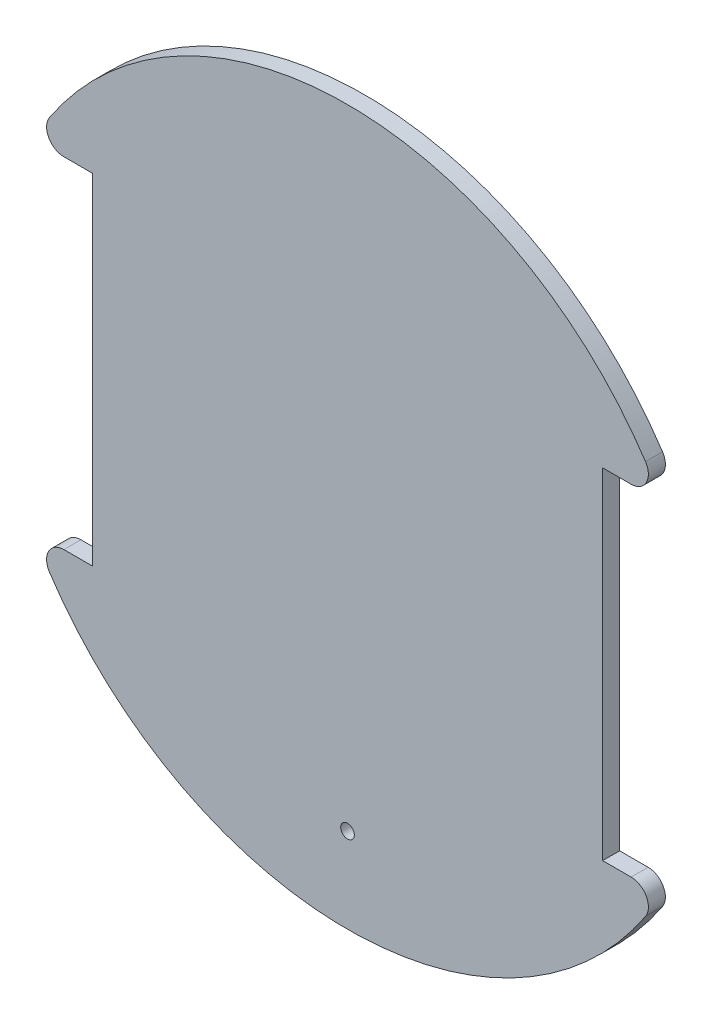
ISO-10303-21;
HEADER;
FILE_DESCRIPTION(('STEP AP214'),'2;1');
FILE_NAME('part.step','',(''),(''),'','','');
FILE_SCHEMA(('AUTOMOTIVE_DESIGN { 1 0 10303 214 1 1 1 1 }'));
ENDSEC;
DATA;
#1=APPLICATION_CONTEXT('core data for automotive mechanical design processes');
#2=APPLICATION_PROTOCOL_DEFINITION('international standard','automotive_design',2000,#1);
#3=PRODUCT_CONTEXT('',#1,'mechanical');
#4=PRODUCT('Part','Part','',(#3));
#5=PRODUCT_RELATED_PRODUCT_CATEGORY('part','',(#4));
#6=PRODUCT_DEFINITION_FORMATION('','',#4);
#7=PRODUCT_DEFINITION_CONTEXT('part definition',#1,'design');
#8=PRODUCT_DEFINITION('design','',#6,#7);
#9=PRODUCT_DEFINITION_SHAPE('','',#8);
#10=(LENGTH_UNIT() NAMED_UNIT(*) SI_UNIT(.MILLI.,.METRE.));
#11=(NAMED_UNIT(*) PLANE_ANGLE_UNIT() SI_UNIT($,.RADIAN.));
#12=(NAMED_UNIT(*) SI_UNIT($,.STERADIAN.) SOLID_ANGLE_UNIT());
#13=UNCERTAINTY_MEASURE_WITH_UNIT(LENGTH_MEASURE(1.E-05),#10,'distance_accuracy_value','');
#14=(GEOMETRIC_REPRESENTATION_CONTEXT(3) GLOBAL_UNCERTAINTY_ASSIGNED_CONTEXT((#13)) GLOBAL_UNIT_ASSIGNED_CONTEXT((#10,
#11,#12)) REPRESENTATION_CONTEXT('',''));
#15=CARTESIAN_POINT('',(0.,0.,0.));
#16=DIRECTION('',(0.,0.,1.));
#17=DIRECTION('',(1.,0.,0.));
#18=AXIS2_PLACEMENT_3D('',#15,#16,#17);
#19=CARTESIAN_POINT('',(0.,0.,5.));
#20=DIRECTION('',(0.,0.,-1.));
#21=DIRECTION('',(-1.,0.,0.));
#22=AXIS2_PLACEMENT_3D('',#19,#20,#21);
#23=CYLINDRICAL_SURFACE('',#22,105.);
#24=CARTESIAN_POINT('',(0.,0.,0.));
#25=DIRECTION('',(0.,0.,1.));
#26=DIRECTION('',(1.,0.,0.));
#27=AXIS2_PLACEMENT_3D('',#24,#25,#26);
#28=CIRCLE('',#27,105.);
#29=CARTESIAN_POINT('',(87.6063375600879,57.8803042433948,0.));
#30=VERTEX_POINT('',#29);
#31=CARTESIAN_POINT('',(-87.6063375600879,57.8803042433947,0.));
#32=VERTEX_POINT('',#31);
#33=EDGE_CURVE('E188',#30,#32,#28,.T.);
#34=ORIENTED_EDGE('',*,*,#33,.T.);
#35=DIRECTION('',(0.,0.,-1.));
#36=VECTOR('',#35,1.);
#37=CARTESIAN_POINT('',(-87.6063375600879,57.8803042433947,5.));
#38=LINE('',#37,#36);
#39=CARTESIAN_POINT('',(-87.6063375600879,57.8803042433947,5.));
#40=VERTEX_POINT('',#39);
#41=EDGE_CURVE('E232',#32,#40,#38,.F.);
#42=ORIENTED_EDGE('',*,*,#41,.T.);
#43=CARTESIAN_POINT('',(0.,0.,5.));
#44=DIRECTION('',(0.,0.,1.));
#45=DIRECTION('',(1.,0.,0.));
#46=AXIS2_PLACEMENT_3D('',#43,#44,#45);
#47=CIRCLE('',#46,105.);
#48=CARTESIAN_POINT('',(87.6063375600879,57.8803042433948,5.));
#49=VERTEX_POINT('',#48);
#50=EDGE_CURVE('E193',#49,#40,#47,.T.);
#51=ORIENTED_EDGE('',*,*,#50,.F.);
#52=DIRECTION('',(0.,0.,-1.));
#53=VECTOR('',#52,1.);
#54=CARTESIAN_POINT('',(87.6063375600879,57.8803042433948,5.));
#55=LINE('',#54,#53);
#56=EDGE_CURVE('E229',#49,#30,#55,.T.);
#57=ORIENTED_EDGE('',*,*,#56,.T.);
#58=EDGE_LOOP('',(#34,#42,#51,#57));
#59=FACE_BOUND('',#58,.T.);
#60=ADVANCED_FACE('F16',(#59),#23,.T.);
#61=CARTESIAN_POINT('',(-87.6063375600879,-57.8803042433947,5.));
#62=VERTEX_POINT('',#61);
#63=CARTESIAN_POINT('',(87.6063375600879,-57.8803042433947,5.));
#64=VERTEX_POINT('',#63);
#65=EDGE_CURVE('E189',#62,#64,#47,.T.);
#66=ORIENTED_EDGE('',*,*,#65,.F.);
#67=DIRECTION('',(0.,0.,-1.));
#68=VECTOR('',#67,1.);
#69=CARTESIAN_POINT('',(-87.6063375600879,-57.8803042433947,5.));
#70=LINE('',#69,#68);
#71=CARTESIAN_POINT('',(-87.6063375600879,-57.8803042433947,0.));
#72=VERTEX_POINT('',#71);
#73=EDGE_CURVE('E249',#62,#72,#70,.T.);
#74=ORIENTED_EDGE('',*,*,#73,.T.);
#75=CARTESIAN_POINT('',(87.6063375600879,-57.8803042433947,0.));
#76=VERTEX_POINT('',#75);
#77=EDGE_CURVE('E194',#72,#76,#28,.T.);
#78=ORIENTED_EDGE('',*,*,#77,.T.);
#79=DIRECTION('',(0.,0.,-1.));
#80=VECTOR('',#79,1.);
#81=CARTESIAN_POINT('',(87.6063375600879,-57.8803042433947,5.));
#82=LINE('',#81,#80);
#83=EDGE_CURVE('E246',#76,#64,#82,.F.);
#84=ORIENTED_EDGE('',*,*,#83,.T.);
#85=EDGE_LOOP('',(#66,#74,#78,#84));
#86=FACE_BOUND('',#85,.T.);
#87=ADVANCED_FACE('F266',(#86),#23,.T.);
#88=CARTESIAN_POINT('',(0.,0.,5.));
#89=DIRECTION('',(0.,0.,1.));
#90=DIRECTION('',(1.,0.,0.));
#91=AXIS2_PLACEMENT_3D('',#88,#89,#90);
#92=PLANE('',#91);
#93=CARTESIAN_POINT('',(0.,-80.,5.));
#94=DIRECTION('',(0.,0.,1.));
#95=DIRECTION('',(1.,0.,0.));
#96=AXIS2_PLACEMENT_3D('',#93,#94,#95);
#97=CIRCLE('',#96,2.);
#98=CARTESIAN_POINT('',(2.,-80.,5.));
#99=VERTEX_POINT('',#98);
#100=EDGE_CURVE('E364',#99,#99,#97,.T.);
#101=ORIENTED_EDGE('',*,*,#100,.F.);
#102=EDGE_LOOP('',(#101));
#103=FACE_BOUND('',#102,.T.);
#104=ORIENTED_EDGE('',*,*,#50,.T.);
#105=CARTESIAN_POINT('',(-83.3678595143236,55.08,5.));
#106=DIRECTION('',(0.,0.,1.));
#107=DIRECTION('',(1.,0.,0.));
#108=AXIS2_PLACEMENT_3D('',#105,#106,#107);
#109=CIRCLE('',#108,5.08);
#110=CARTESIAN_POINT('',(-83.3678595143236,50.,5.));
#111=VERTEX_POINT('',#110);
#112=EDGE_CURVE('E243',#40,#111,#109,.T.);
#113=ORIENTED_EDGE('',*,*,#112,.T.);
#114=DIRECTION('',(1.,0.,0.));
#115=VECTOR('',#114,1.);
#116=CARTESIAN_POINT('',(0.,50.,5.));
#117=LINE('',#116,#115);
#118=CARTESIAN_POINT('',(-75.,50.,5.));
#119=VERTEX_POINT('',#118);
#120=EDGE_CURVE('E181',#111,#119,#117,.T.);
#121=ORIENTED_EDGE('',*,*,#120,.T.);
#122=DIRECTION('',(0.,-1.,0.));
#123=VECTOR('',#122,1.);
#124=CARTESIAN_POINT('',(-75.,0.,5.));
#125=LINE('',#124,#123);
#126=CARTESIAN_POINT('',(-75.,-50.,5.));
#127=VERTEX_POINT('',#126);
#128=EDGE_CURVE('E184',#119,#127,#125,.T.);
#129=ORIENTED_EDGE('',*,*,#128,.T.);
#130=DIRECTION('',(1.,0.,0.));
#131=VECTOR('',#130,1.);
#132=CARTESIAN_POINT('',(0.,-50.,5.));
#133=LINE('',#132,#131);
#134=CARTESIAN_POINT('',(-83.3678595143236,-50.,5.));
#135=VERTEX_POINT('',#134);
#136=EDGE_CURVE('E174',#135,#127,#133,.T.);
#137=ORIENTED_EDGE('',*,*,#136,.F.);
#138=CARTESIAN_POINT('',(-83.3678595143236,-55.08,5.));
#139=DIRECTION('',(0.,0.,1.));
#140=DIRECTION('',(1.,0.,0.));
#141=AXIS2_PLACEMENT_3D('',#138,#139,#140);
#142=CIRCLE('',#141,5.08);
#143=EDGE_CURVE('E240',#135,#62,#142,.T.);
#144=ORIENTED_EDGE('',*,*,#143,.T.);
#145=ORIENTED_EDGE('',*,*,#65,.T.);
#146=CARTESIAN_POINT('',(83.3678595143236,-55.08,5.));
#147=DIRECTION('',(0.,0.,1.));
#148=DIRECTION('',(1.,0.,0.));
#149=AXIS2_PLACEMENT_3D('',#146,#147,#148);
#150=CIRCLE('',#149,5.08);
#151=CARTESIAN_POINT('',(83.3678595143236,-50.,5.));
#152=VERTEX_POINT('',#151);
#153=EDGE_CURVE('E38',#64,#152,#150,.T.);
#154=ORIENTED_EDGE('',*,*,#153,.T.);
#155=DIRECTION('',(1.,0.,0.));
#156=VECTOR('',#155,1.);
#157=CARTESIAN_POINT('',(0.,-50.,5.));
#158=LINE('',#157,#156);
#159=CARTESIAN_POINT('',(75.,-50.,5.));
#160=VERTEX_POINT('',#159);
#161=EDGE_CURVE('E139',#160,#152,#158,.T.);
#162=ORIENTED_EDGE('',*,*,#161,.F.);
#163=DIRECTION('',(0.,-1.,0.));
#164=VECTOR('',#163,1.);
#165=CARTESIAN_POINT('',(75.,0.,5.));
#166=LINE('',#165,#164);
#167=CARTESIAN_POINT('',(75.,50.,5.));
#168=VERTEX_POINT('',#167);
#169=EDGE_CURVE('E151',#168,#160,#166,.T.);
#170=ORIENTED_EDGE('',*,*,#169,.F.);
#171=DIRECTION('',(-1.,0.,0.));
#172=VECTOR('',#171,1.);
#173=CARTESIAN_POINT('',(0.,50.,5.));
#174=LINE('',#173,#172);
#175=CARTESIAN_POINT('',(83.3678595143236,50.,5.));
#176=VERTEX_POINT('',#175);
#177=EDGE_CURVE('E147',#176,#168,#174,.T.);
#178=ORIENTED_EDGE('',*,*,#177,.F.);
#179=CARTESIAN_POINT('',(83.3678595143236,55.08,5.));
#180=DIRECTION('',(0.,0.,1.));
#181=DIRECTION('',(1.,0.,0.));
#182=AXIS2_PLACEMENT_3D('',#179,#180,#181);
#183=CIRCLE('',#182,5.08);
#184=EDGE_CURVE('E235',#176,#49,#183,.T.);
#185=ORIENTED_EDGE('',*,*,#184,.T.);
#186=EDGE_LOOP('',(#104,#113,#121,#129,#137,#144,#145,#154,#162,#170,#178,#185));
#187=FACE_BOUND('',#186,.T.);
#188=ADVANCED_FACE('F158',(#103,#187),#92,.T.);
#189=CARTESIAN_POINT('',(0.,0.,0.));
#190=DIRECTION('',(0.,0.,1.));
#191=DIRECTION('',(1.,0.,0.));
#192=AXIS2_PLACEMENT_3D('',#189,#190,#191);
#193=PLANE('',#192);
#194=CARTESIAN_POINT('',(0.,-80.,0.));
#195=DIRECTION('',(0.,0.,1.));
#196=DIRECTION('',(1.,0.,0.));
#197=AXIS2_PLACEMENT_3D('',#194,#195,#196);
#198=CIRCLE('',#197,2.);
#199=CARTESIAN_POINT('',(2.,-80.,0.));
#200=VERTEX_POINT('',#199);
#201=EDGE_CURVE('E20',#200,#200,#198,.T.);
#202=ORIENTED_EDGE('',*,*,#201,.T.);
#203=EDGE_LOOP('',(#202));
#204=FACE_BOUND('',#203,.T.);
#205=DIRECTION('',(1.,0.,0.));
#206=VECTOR('',#205,1.);
#207=CARTESIAN_POINT('',(0.,50.,0.));
#208=LINE('',#207,#206);
#209=CARTESIAN_POINT('',(-83.3678595143236,50.,0.));
#210=VERTEX_POINT('',#209);
#211=CARTESIAN_POINT('',(-75.,50.,0.));
#212=VERTEX_POINT('',#211);
#213=EDGE_CURVE('E192',#210,#212,#208,.T.);
#214=ORIENTED_EDGE('',*,*,#213,.F.);
#215=CARTESIAN_POINT('',(-83.3678595143236,55.08,0.));
#216=DIRECTION('',(0.,0.,1.));
#217=DIRECTION('',(1.,0.,0.));
#218=AXIS2_PLACEMENT_3D('',#215,#216,#217);
#219=CIRCLE('',#218,5.08);
#220=EDGE_CURVE('E226',#210,#32,#219,.F.);
#221=ORIENTED_EDGE('',*,*,#220,.T.);
#222=ORIENTED_EDGE('',*,*,#33,.F.);
#223=CARTESIAN_POINT('',(83.3678595143236,55.08,0.));
#224=DIRECTION('',(0.,0.,1.));
#225=DIRECTION('',(1.,0.,0.));
#226=AXIS2_PLACEMENT_3D('',#223,#224,#225);
#227=CIRCLE('',#226,5.08);
#228=CARTESIAN_POINT('',(83.3678595143236,50.,0.));
#229=VERTEX_POINT('',#228);
#230=EDGE_CURVE('E217',#30,#229,#227,.F.);
#231=ORIENTED_EDGE('',*,*,#230,.T.);
#232=DIRECTION('',(-1.,0.,0.));
#233=VECTOR('',#232,1.);
#234=CARTESIAN_POINT('',(0.,50.,0.));
#235=LINE('',#234,#233);
#236=CARTESIAN_POINT('',(75.,50.,0.));
#237=VERTEX_POINT('',#236);
#238=EDGE_CURVE('E210',#229,#237,#235,.T.);
#239=ORIENTED_EDGE('',*,*,#238,.T.);
#240=DIRECTION('',(0.,-1.,0.));
#241=VECTOR('',#240,1.);
#242=CARTESIAN_POINT('',(75.,0.,0.));
#243=LINE('',#242,#241);
#244=CARTESIAN_POINT('',(75.,-50.,0.));
#245=VERTEX_POINT('',#244);
#246=EDGE_CURVE('E207',#237,#245,#243,.T.);
#247=ORIENTED_EDGE('',*,*,#246,.T.);
#248=DIRECTION('',(1.,0.,0.));
#249=VECTOR('',#248,1.);
#250=CARTESIAN_POINT('',(0.,-50.,0.));
#251=LINE('',#250,#249);
#252=CARTESIAN_POINT('',(83.3678595143236,-50.,0.));
#253=VERTEX_POINT('',#252);
#254=EDGE_CURVE('E141',#245,#253,#251,.T.);
#255=ORIENTED_EDGE('',*,*,#254,.T.);
#256=CARTESIAN_POINT('',(83.3678595143236,-55.08,0.));
#257=DIRECTION('',(0.,0.,1.));
#258=DIRECTION('',(1.,0.,0.));
#259=AXIS2_PLACEMENT_3D('',#256,#257,#258);
#260=CIRCLE('',#259,5.08);
#261=EDGE_CURVE('E220',#253,#76,#260,.F.);
#262=ORIENTED_EDGE('',*,*,#261,.T.);
#263=ORIENTED_EDGE('',*,*,#77,.F.);
#264=CARTESIAN_POINT('',(-83.3678595143236,-55.08,0.));
#265=DIRECTION('',(0.,0.,1.));
#266=DIRECTION('',(1.,0.,0.));
#267=AXIS2_PLACEMENT_3D('',#264,#265,#266);
#268=CIRCLE('',#267,5.08);
#269=CARTESIAN_POINT('',(-83.3678595143236,-50.,0.));
#270=VERTEX_POINT('',#269);
#271=EDGE_CURVE('E223',#72,#270,#268,.F.);
#272=ORIENTED_EDGE('',*,*,#271,.T.);
#273=DIRECTION('',(1.,0.,0.));
#274=VECTOR('',#273,1.);
#275=CARTESIAN_POINT('',(0.,-50.,0.));
#276=LINE('',#275,#274);
#277=CARTESIAN_POINT('',(-75.,-50.,0.));
#278=VERTEX_POINT('',#277);
#279=EDGE_CURVE('E203',#270,#278,#276,.T.);
#280=ORIENTED_EDGE('',*,*,#279,.T.);
#281=DIRECTION('',(0.,-1.,0.));
#282=VECTOR('',#281,1.);
#283=CARTESIAN_POINT('',(-75.,0.,0.));
#284=LINE('',#283,#282);
#285=EDGE_CURVE('E199',#212,#278,#284,.T.);
#286=ORIENTED_EDGE('',*,*,#285,.F.);
#287=EDGE_LOOP('',(#214,#221,#222,#231,#239,#247,#255,#262,#263,#272,#280,#286));
#288=FACE_BOUND('',#287,.T.);
#289=ADVANCED_FACE('F261',(#204,#288),#193,.F.);
#290=CARTESIAN_POINT('',(-75.,0.,31.));
#291=DIRECTION('',(-1.,0.,0.));
#292=DIRECTION('',(0.,0.,1.));
#293=AXIS2_PLACEMENT_3D('',#290,#291,#292);
#294=PLANE('',#293);
#295=DIRECTION('',(0.,0.,-1.));
#296=VECTOR('',#295,1.);
#297=CARTESIAN_POINT('',(-75.,50.,31.));
#298=LINE('',#297,#296);
#299=EDGE_CURVE('E177',#119,#212,#298,.T.);
#300=ORIENTED_EDGE('',*,*,#299,.T.);
#301=ORIENTED_EDGE('',*,*,#285,.T.);
#302=DIRECTION('',(0.,0.,1.));
#303=VECTOR('',#302,1.);
#304=CARTESIAN_POINT('',(-75.,-50.,-30.));
#305=LINE('',#304,#303);
#306=EDGE_CURVE('E169',#278,#127,#305,.T.);
#307=ORIENTED_EDGE('',*,*,#306,.T.);
#308=ORIENTED_EDGE('',*,*,#128,.F.);
#309=EDGE_LOOP('',(#300,#301,#307,#308));
#310=FACE_BOUND('',#309,.T.);
#311=ADVANCED_FACE('F280',(#310),#294,.T.);
#312=CARTESIAN_POINT('',(-105.,50.,31.));
#313=DIRECTION('',(0.,-1.,0.));
#314=DIRECTION('',(0.,0.,-1.));
#315=AXIS2_PLACEMENT_3D('',#312,#313,#314);
#316=PLANE('',#315);
#317=ORIENTED_EDGE('',*,*,#120,.F.);
#318=DIRECTION('',(0.,0.,1.));
#319=VECTOR('',#318,1.);
#320=CARTESIAN_POINT('',(-83.3678595143236,50.,0.));
#321=LINE('',#320,#319);
#322=EDGE_CURVE('E213',#111,#210,#321,.F.);
#323=ORIENTED_EDGE('',*,*,#322,.T.);
#324=ORIENTED_EDGE('',*,*,#213,.T.);
#325=ORIENTED_EDGE('',*,*,#299,.F.);
#326=EDGE_LOOP('',(#317,#323,#324,#325));
#327=FACE_BOUND('',#326,.T.);
#328=ADVANCED_FACE('F286',(#327),#316,.T.);
#329=CARTESIAN_POINT('',(-75.,-50.,-30.));
#330=DIRECTION('',(0.,-1.,0.));
#331=DIRECTION('',(1.,0.,0.));
#332=AXIS2_PLACEMENT_3D('',#329,#330,#331);
#333=PLANE('',#332);
#334=ORIENTED_EDGE('',*,*,#279,.F.);
#335=DIRECTION('',(0.,0.,-1.));
#336=VECTOR('',#335,1.);
#337=CARTESIAN_POINT('',(-83.3678595143236,-50.,-30.));
#338=LINE('',#337,#336);
#339=EDGE_CURVE('E253',#270,#135,#338,.F.);
#340=ORIENTED_EDGE('',*,*,#339,.T.);
#341=ORIENTED_EDGE('',*,*,#136,.T.);
#342=ORIENTED_EDGE('',*,*,#306,.F.);
#343=EDGE_LOOP('',(#334,#340,#341,#342));
#344=FACE_BOUND('',#343,.T.);
#345=ADVANCED_FACE('F277',(#344),#333,.F.);
#346=CARTESIAN_POINT('',(75.,0.,-36.));
#347=DIRECTION('',(-1.,0.,0.));
#348=DIRECTION('',(0.,0.,1.));
#349=AXIS2_PLACEMENT_3D('',#346,#347,#348);
#350=PLANE('',#349);
#351=DIRECTION('',(0.,0.,1.));
#352=VECTOR('',#351,1.);
#353=CARTESIAN_POINT('',(75.,50.,-36.));
#354=LINE('',#353,#352);
#355=EDGE_CURVE('E146',#237,#168,#354,.T.);
#356=ORIENTED_EDGE('',*,*,#355,.T.);
#357=ORIENTED_EDGE('',*,*,#169,.T.);
#358=DIRECTION('',(0.,0.,1.));
#359=VECTOR('',#358,1.);
#360=CARTESIAN_POINT('',(75.,-50.,-36.));
#361=LINE('',#360,#359);
#362=EDGE_CURVE('E136',#245,#160,#361,.T.);
#363=ORIENTED_EDGE('',*,*,#362,.F.);
#364=ORIENTED_EDGE('',*,*,#246,.F.);
#365=EDGE_LOOP('',(#356,#357,#363,#364));
#366=FACE_BOUND('',#365,.T.);
#367=ADVANCED_FACE('F152',(#366),#350,.F.);
#368=CARTESIAN_POINT('',(0.,50.,-36.));
#369=DIRECTION('',(0.,1.,0.));
#370=DIRECTION('',(-1.,0.,0.));
#371=AXIS2_PLACEMENT_3D('',#368,#369,#370);
#372=PLANE('',#371);
#373=ORIENTED_EDGE('',*,*,#238,.F.);
#374=DIRECTION('',(0.,0.,-1.));
#375=VECTOR('',#374,1.);
#376=CARTESIAN_POINT('',(83.3678595143236,50.,-36.));
#377=LINE('',#376,#375);
#378=EDGE_CURVE('E10',#229,#176,#377,.F.);
#379=ORIENTED_EDGE('',*,*,#378,.T.);
#380=ORIENTED_EDGE('',*,*,#177,.T.);
#381=ORIENTED_EDGE('',*,*,#355,.F.);
#382=EDGE_LOOP('',(#373,#379,#380,#381));
#383=FACE_BOUND('',#382,.T.);
#384=ADVANCED_FACE('F328',(#383),#372,.F.);
#385=CARTESIAN_POINT('',(0.,-50.,-36.));
#386=DIRECTION('',(0.,-1.,0.));
#387=DIRECTION('',(0.,0.,-1.));
#388=AXIS2_PLACEMENT_3D('',#385,#386,#387);
#389=PLANE('',#388);
#390=ORIENTED_EDGE('',*,*,#161,.T.);
#391=DIRECTION('',(0.,0.,-1.));
#392=VECTOR('',#391,1.);
#393=CARTESIAN_POINT('',(83.3678595143236,-50.,-36.));
#394=LINE('',#393,#392);
#395=EDGE_CURVE('E26',#152,#253,#394,.T.);
#396=ORIENTED_EDGE('',*,*,#395,.T.);
#397=ORIENTED_EDGE('',*,*,#254,.F.);
#398=ORIENTED_EDGE('',*,*,#362,.T.);
#399=EDGE_LOOP('',(#390,#396,#397,#398));
#400=FACE_BOUND('',#399,.T.);
#401=ADVANCED_FACE('F138',(#400),#389,.F.);
#402=CARTESIAN_POINT('',(-83.3678595143236,55.08,5.));
#403=DIRECTION('',(0.,0.,-1.));
#404=DIRECTION('',(-1.,0.,0.));
#405=AXIS2_PLACEMENT_3D('',#402,#403,#404);
#406=CYLINDRICAL_SURFACE('',#405,5.08);
#407=ORIENTED_EDGE('',*,*,#112,.F.);
#408=ORIENTED_EDGE('',*,*,#41,.F.);
#409=ORIENTED_EDGE('',*,*,#220,.F.);
#410=ORIENTED_EDGE('',*,*,#322,.F.);
#411=EDGE_LOOP('',(#407,#408,#409,#410));
#412=FACE_BOUND('',#411,.T.);
#413=ADVANCED_FACE('F290',(#412),#406,.T.);
#414=CARTESIAN_POINT('',(-83.3678595143236,-55.08,5.));
#415=DIRECTION('',(0.,0.,-1.));
#416=DIRECTION('',(-1.,0.,0.));
#417=AXIS2_PLACEMENT_3D('',#414,#415,#416);
#418=CYLINDRICAL_SURFACE('',#417,5.08);
#419=ORIENTED_EDGE('',*,*,#143,.F.);
#420=ORIENTED_EDGE('',*,*,#339,.F.);
#421=ORIENTED_EDGE('',*,*,#271,.F.);
#422=ORIENTED_EDGE('',*,*,#73,.F.);
#423=EDGE_LOOP('',(#419,#420,#421,#422));
#424=FACE_BOUND('',#423,.T.);
#425=ADVANCED_FACE('F272',(#424),#418,.T.);
#426=CARTESIAN_POINT('',(83.3678595143236,-55.08,5.));
#427=DIRECTION('',(0.,0.,-1.));
#428=DIRECTION('',(-1.,0.,0.));
#429=AXIS2_PLACEMENT_3D('',#426,#427,#428);
#430=CYLINDRICAL_SURFACE('',#429,5.08);
#431=ORIENTED_EDGE('',*,*,#261,.F.);
#432=ORIENTED_EDGE('',*,*,#395,.F.);
#433=ORIENTED_EDGE('',*,*,#153,.F.);
#434=ORIENTED_EDGE('',*,*,#83,.F.);
#435=EDGE_LOOP('',(#431,#432,#433,#434));
#436=FACE_BOUND('',#435,.T.);
#437=ADVANCED_FACE('F263',(#436),#430,.T.);
#438=CARTESIAN_POINT('',(83.3678595143236,55.08,5.));
#439=DIRECTION('',(0.,0.,-1.));
#440=DIRECTION('',(-1.,0.,0.));
#441=AXIS2_PLACEMENT_3D('',#438,#439,#440);
#442=CYLINDRICAL_SURFACE('',#441,5.08);
#443=ORIENTED_EDGE('',*,*,#230,.F.);
#444=ORIENTED_EDGE('',*,*,#56,.F.);
#445=ORIENTED_EDGE('',*,*,#184,.F.);
#446=ORIENTED_EDGE('',*,*,#378,.F.);
#447=EDGE_LOOP('',(#443,#444,#445,#446));
#448=FACE_BOUND('',#447,.T.);
#449=ADVANCED_FACE('F18',(#448),#442,.T.);
#450=CARTESIAN_POINT('',(0.,-80.,-20.));
#451=DIRECTION('',(0.,0.,1.));
#452=DIRECTION('',(1.,0.,0.));
#453=AXIS2_PLACEMENT_3D('',#450,#451,#452);
#454=CYLINDRICAL_SURFACE('',#453,2.);
#455=ORIENTED_EDGE('',*,*,#100,.T.);
#456=EDGE_LOOP('',(#455));
#457=FACE_BOUND('',#456,.T.);
#458=ORIENTED_EDGE('',*,*,#201,.F.);
#459=EDGE_LOOP('',(#458));
#460=FACE_BOUND('',#459,.T.);
#461=ADVANCED_FACE('F354',(#457,#460),#454,.F.);
#462=CLOSED_SHELL('',(#60,#87,#188,#289,#311,#328,#345,#367,#384,#401,#413,#425,#437,#449,#461));
#463=MANIFOLD_SOLID_BREP('B1',#462);
#464=ADVANCED_BREP_SHAPE_REPRESENTATION('',(#18,#463),#14);
#465=SHAPE_DEFINITION_REPRESENTATION(#9,#464);
ENDSEC;
END-ISO-10303-21;
